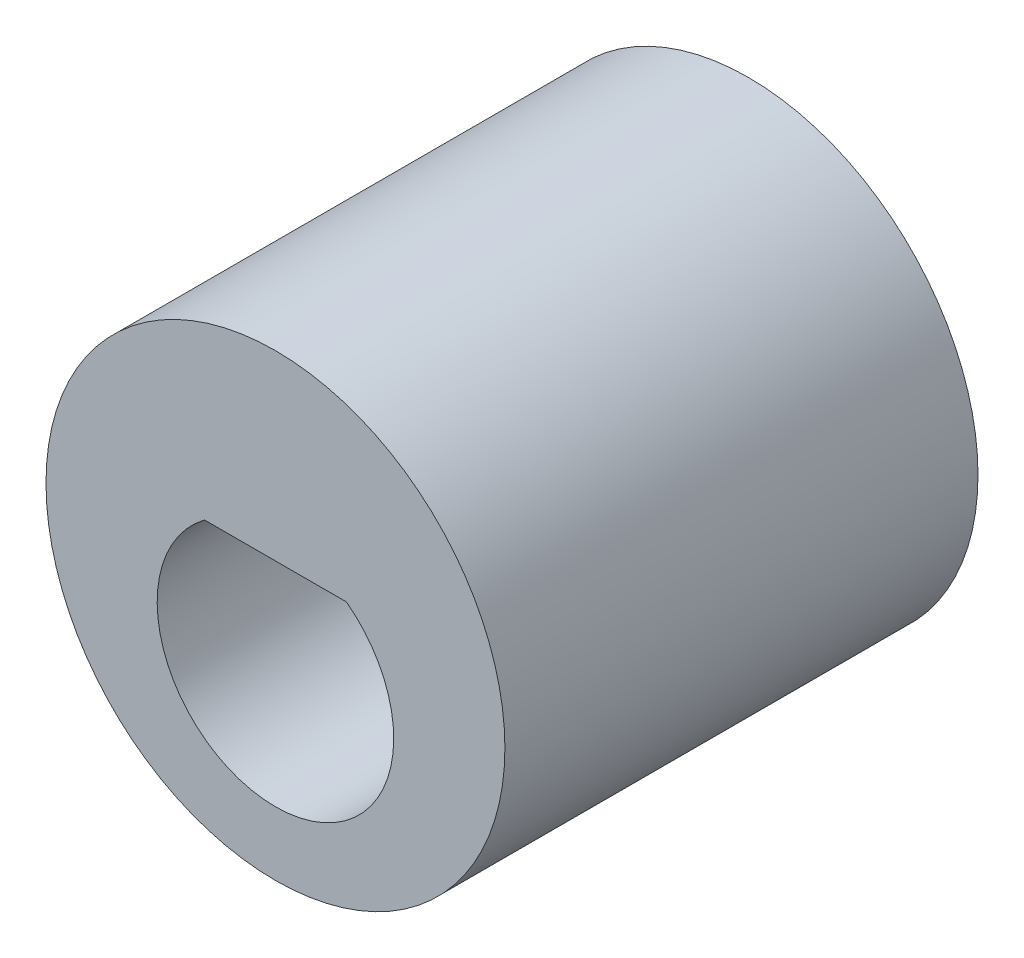
ISO-10303-21;
HEADER;
FILE_DESCRIPTION(('STEP AP214'),'2;1');
FILE_NAME('part.step','',(''),(''),'','','');
FILE_SCHEMA(('AUTOMOTIVE_DESIGN { 1 0 10303 214 1 1 1 1 }'));
ENDSEC;
DATA;
#1=APPLICATION_CONTEXT('core data for automotive mechanical design processes');
#2=APPLICATION_PROTOCOL_DEFINITION('international standard','automotive_design',2000,#1);
#3=PRODUCT_CONTEXT('',#1,'mechanical');
#4=PRODUCT('Part','Part','',(#3));
#5=PRODUCT_RELATED_PRODUCT_CATEGORY('part','',(#4));
#6=PRODUCT_DEFINITION_FORMATION('','',#4);
#7=PRODUCT_DEFINITION_CONTEXT('part definition',#1,'design');
#8=PRODUCT_DEFINITION('design','',#6,#7);
#9=PRODUCT_DEFINITION_SHAPE('','',#8);
#10=(LENGTH_UNIT() NAMED_UNIT(*) SI_UNIT(.MILLI.,.METRE.));
#11=(NAMED_UNIT(*) PLANE_ANGLE_UNIT() SI_UNIT($,.RADIAN.));
#12=(NAMED_UNIT(*) SI_UNIT($,.STERADIAN.) SOLID_ANGLE_UNIT());
#13=UNCERTAINTY_MEASURE_WITH_UNIT(LENGTH_MEASURE(1.E-05),#10,'distance_accuracy_value','');
#14=(GEOMETRIC_REPRESENTATION_CONTEXT(3) GLOBAL_UNCERTAINTY_ASSIGNED_CONTEXT((#13)) GLOBAL_UNIT_ASSIGNED_CONTEXT((#10,
#11,#12)) REPRESENTATION_CONTEXT('',''));
#15=CARTESIAN_POINT('',(0.,0.,0.));
#16=DIRECTION('',(0.,0.,1.));
#17=DIRECTION('',(1.,0.,0.));
#18=AXIS2_PLACEMENT_3D('',#15,#16,#17);
#19=CARTESIAN_POINT('',(0.,0.,10.));
#20=DIRECTION('',(0.,0.,-1.));
#21=DIRECTION('',(-1.,0.,0.));
#22=AXIS2_PLACEMENT_3D('',#19,#20,#21);
#23=CYLINDRICAL_SURFACE('',#22,2.5);
#24=CARTESIAN_POINT('',(0.,0.,0.));
#25=DIRECTION('',(0.,0.,1.));
#26=DIRECTION('',(1.,0.,0.));
#27=AXIS2_PLACEMENT_3D('',#24,#25,#26);
#28=CIRCLE('',#27,2.5);
#29=CARTESIAN_POINT('',(-1.5,2.,0.));
#30=VERTEX_POINT('',#29);
#31=CARTESIAN_POINT('',(1.5,2.,0.));
#32=VERTEX_POINT('',#31);
#33=EDGE_CURVE('E65',#30,#32,#28,.T.);
#34=ORIENTED_EDGE('',*,*,#33,.F.);
#35=DIRECTION('',(0.,0.,-1.));
#36=VECTOR('',#35,1.);
#37=CARTESIAN_POINT('',(-1.5,2.,10.));
#38=LINE('',#37,#36);
#39=CARTESIAN_POINT('',(-1.5,2.,10.));
#40=VERTEX_POINT('',#39);
#41=EDGE_CURVE('E11',#40,#30,#38,.T.);
#42=ORIENTED_EDGE('',*,*,#41,.F.);
#43=CARTESIAN_POINT('',(0.,0.,10.));
#44=DIRECTION('',(0.,0.,1.));
#45=DIRECTION('',(1.,0.,0.));
#46=AXIS2_PLACEMENT_3D('',#43,#44,#45);
#47=CIRCLE('',#46,2.5);
#48=CARTESIAN_POINT('',(1.5,2.,10.));
#49=VERTEX_POINT('',#48);
#50=EDGE_CURVE('E66',#40,#49,#47,.T.);
#51=ORIENTED_EDGE('',*,*,#50,.T.);
#52=DIRECTION('',(0.,0.,-1.));
#53=VECTOR('',#52,1.);
#54=CARTESIAN_POINT('',(1.5,2.,10.));
#55=LINE('',#54,#53);
#56=EDGE_CURVE('E45',#49,#32,#55,.T.);
#57=ORIENTED_EDGE('',*,*,#56,.T.);
#58=EDGE_LOOP('',(#34,#42,#51,#57));
#59=FACE_BOUND('',#58,.T.);
#60=ADVANCED_FACE('F37',(#59),#23,.F.);
#61=CARTESIAN_POINT('',(0.,2.,10.));
#62=DIRECTION('',(0.,1.,0.));
#63=DIRECTION('',(0.,0.,1.));
#64=AXIS2_PLACEMENT_3D('',#61,#62,#63);
#65=PLANE('',#64);
#66=DIRECTION('',(1.,0.,0.));
#67=VECTOR('',#66,1.);
#68=CARTESIAN_POINT('',(0.,2.,0.));
#69=LINE('',#68,#67);
#70=EDGE_CURVE('E68',#30,#32,#69,.T.);
#71=ORIENTED_EDGE('',*,*,#70,.T.);
#72=ORIENTED_EDGE('',*,*,#56,.F.);
#73=DIRECTION('',(1.,0.,0.));
#74=VECTOR('',#73,1.);
#75=CARTESIAN_POINT('',(0.,2.,10.));
#76=LINE('',#75,#74);
#77=EDGE_CURVE('E52',#40,#49,#76,.T.);
#78=ORIENTED_EDGE('',*,*,#77,.F.);
#79=ORIENTED_EDGE('',*,*,#41,.T.);
#80=EDGE_LOOP('',(#71,#72,#78,#79));
#81=FACE_BOUND('',#80,.T.);
#82=ADVANCED_FACE('F69',(#81),#65,.F.);
#83=CARTESIAN_POINT('',(0.,1.,10.));
#84=DIRECTION('',(0.,0.,-1.));
#85=DIRECTION('',(-1.,0.,0.));
#86=AXIS2_PLACEMENT_3D('',#83,#84,#85);
#87=CYLINDRICAL_SURFACE('',#86,4.85);
#88=CARTESIAN_POINT('',(0.,1.,10.));
#89=DIRECTION('',(0.,0.,1.));
#90=DIRECTION('',(1.,0.,0.));
#91=AXIS2_PLACEMENT_3D('',#88,#89,#90);
#92=CIRCLE('',#91,4.85);
#93=CARTESIAN_POINT('',(4.85,1.,10.));
#94=VERTEX_POINT('',#93);
#95=EDGE_CURVE('E67',#94,#94,#92,.T.);
#96=ORIENTED_EDGE('',*,*,#95,.F.);
#97=EDGE_LOOP('',(#96));
#98=FACE_BOUND('',#97,.T.);
#99=CARTESIAN_POINT('',(0.,1.,0.));
#100=DIRECTION('',(0.,0.,1.));
#101=DIRECTION('',(1.,0.,0.));
#102=AXIS2_PLACEMENT_3D('',#99,#100,#101);
#103=CIRCLE('',#102,4.85);
#104=CARTESIAN_POINT('',(4.85,1.,0.));
#105=VERTEX_POINT('',#104);
#106=EDGE_CURVE('E71',#105,#105,#103,.T.);
#107=ORIENTED_EDGE('',*,*,#106,.T.);
#108=EDGE_LOOP('',(#107));
#109=FACE_BOUND('',#108,.T.);
#110=ADVANCED_FACE('F88',(#98,#109),#87,.T.);
#111=CARTESIAN_POINT('',(0.,0.,10.));
#112=DIRECTION('',(0.,0.,1.));
#113=DIRECTION('',(1.,0.,0.));
#114=AXIS2_PLACEMENT_3D('',#111,#112,#113);
#115=PLANE('',#114);
#116=ORIENTED_EDGE('',*,*,#50,.F.);
#117=ORIENTED_EDGE('',*,*,#77,.T.);
#118=EDGE_LOOP('',(#116,#117));
#119=FACE_BOUND('',#118,.T.);
#120=ORIENTED_EDGE('',*,*,#95,.T.);
#121=EDGE_LOOP('',(#120));
#122=FACE_BOUND('',#121,.T.);
#123=ADVANCED_FACE('F86',(#119,#122),#115,.T.);
#124=CARTESIAN_POINT('',(0.,0.,0.));
#125=DIRECTION('',(0.,0.,1.));
#126=DIRECTION('',(1.,0.,0.));
#127=AXIS2_PLACEMENT_3D('',#124,#125,#126);
#128=PLANE('',#127);
#129=ORIENTED_EDGE('',*,*,#33,.T.);
#130=ORIENTED_EDGE('',*,*,#70,.F.);
#131=EDGE_LOOP('',(#129,#130));
#132=FACE_BOUND('',#131,.T.);
#133=ORIENTED_EDGE('',*,*,#106,.F.);
#134=EDGE_LOOP('',(#133));
#135=FACE_BOUND('',#134,.T.);
#136=ADVANCED_FACE('F73',(#132,#135),#128,.F.);
#137=CLOSED_SHELL('',(#60,#82,#110,#123,#136));
#138=MANIFOLD_SOLID_BREP('B2',#137);
#139=ADVANCED_BREP_SHAPE_REPRESENTATION('',(#18,#138),#14);
#140=SHAPE_DEFINITION_REPRESENTATION(#9,#139);
ENDSEC;
END-ISO-10303-21;
